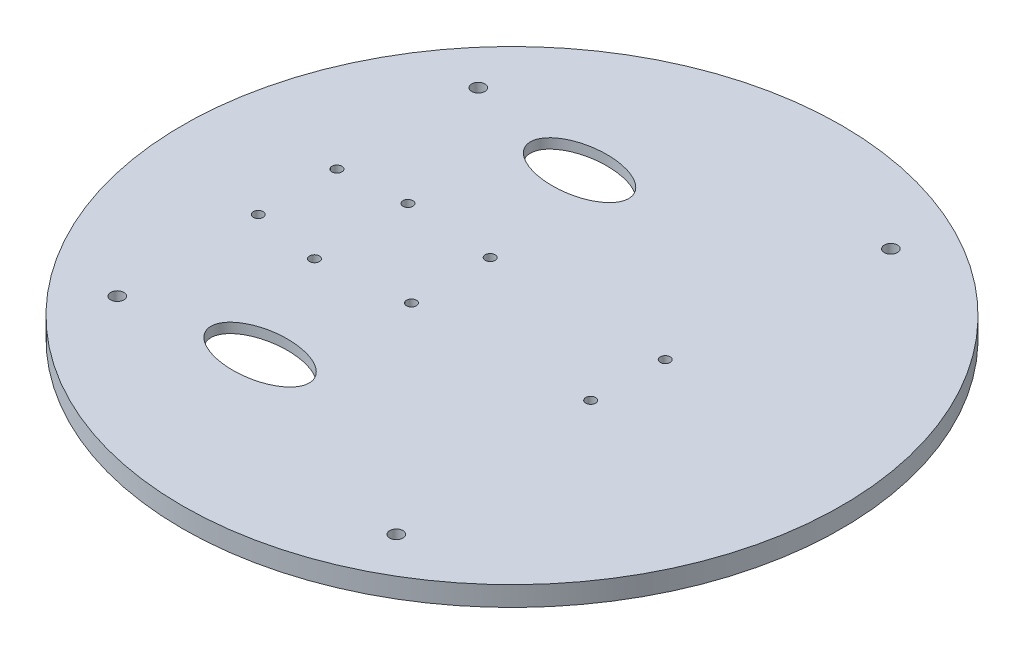
ISO-10303-21;
HEADER;
FILE_DESCRIPTION(('STEP AP214'),'2;1');
FILE_NAME('part.step','',(''),(''),'','','');
FILE_SCHEMA(('AUTOMOTIVE_DESIGN { 1 0 10303 214 1 1 1 1 }'));
ENDSEC;
DATA;
#1=APPLICATION_CONTEXT('core data for automotive mechanical design processes');
#2=APPLICATION_PROTOCOL_DEFINITION('international standard','automotive_design',2000,#1);
#3=PRODUCT_CONTEXT('',#1,'mechanical');
#4=PRODUCT('Part','Part','',(#3));
#5=PRODUCT_RELATED_PRODUCT_CATEGORY('part','',(#4));
#6=PRODUCT_DEFINITION_FORMATION('','',#4);
#7=PRODUCT_DEFINITION_CONTEXT('part definition',#1,'design');
#8=PRODUCT_DEFINITION('design','',#6,#7);
#9=PRODUCT_DEFINITION_SHAPE('','',#8);
#10=(LENGTH_UNIT() NAMED_UNIT(*) SI_UNIT(.MILLI.,.METRE.));
#11=(NAMED_UNIT(*) PLANE_ANGLE_UNIT() SI_UNIT($,.RADIAN.));
#12=(NAMED_UNIT(*) SI_UNIT($,.STERADIAN.) SOLID_ANGLE_UNIT());
#13=UNCERTAINTY_MEASURE_WITH_UNIT(LENGTH_MEASURE(1.E-05),#10,'distance_accuracy_value','');
#14=(GEOMETRIC_REPRESENTATION_CONTEXT(3) GLOBAL_UNCERTAINTY_ASSIGNED_CONTEXT((#13)) GLOBAL_UNIT_ASSIGNED_CONTEXT((#10,
#11,#12)) REPRESENTATION_CONTEXT('',''));
#15=CARTESIAN_POINT('',(0.,0.,0.));
#16=DIRECTION('',(0.,0.,1.));
#17=DIRECTION('',(1.,0.,0.));
#18=AXIS2_PLACEMENT_3D('',#15,#16,#17);
#19=CARTESIAN_POINT('',(0.,0.,0.));
#20=DIRECTION('',(0.,1.,0.));
#21=DIRECTION('',(0.,0.,1.));
#22=AXIS2_PLACEMENT_3D('',#19,#20,#21);
#23=PLANE('',#22);
#24=CARTESIAN_POINT('',(-65.,0.,-54.7722557505167));
#25=DIRECTION('',(0.,1.,0.));
#26=DIRECTION('',(0.,0.,1.));
#27=AXIS2_PLACEMENT_3D('',#24,#25,#26);
#28=CIRCLE('',#27,2.);
#29=CARTESIAN_POINT('',(-65.,0.,-52.7722557505167));
#30=VERTEX_POINT('',#29);
#31=EDGE_CURVE('E63',#30,#30,#28,.T.);
#32=ORIENTED_EDGE('',*,*,#31,.T.);
#33=EDGE_LOOP('',(#32));
#34=FACE_BOUND('',#33,.T.);
#35=CARTESIAN_POINT('',(-65.,0.,54.7722557505167));
#36=DIRECTION('',(0.,1.,0.));
#37=DIRECTION('',(0.,0.,1.));
#38=AXIS2_PLACEMENT_3D('',#35,#36,#37);
#39=CIRCLE('',#38,2.);
#40=CARTESIAN_POINT('',(-65.,0.,56.7722557505167));
#41=VERTEX_POINT('',#40);
#42=EDGE_CURVE('E67',#41,#41,#39,.T.);
#43=ORIENTED_EDGE('',*,*,#42,.T.);
#44=EDGE_LOOP('',(#43));
#45=FACE_BOUND('',#44,.T.);
#46=CARTESIAN_POINT('',(39.936936383401,0.,75.0335998890376));
#47=DIRECTION('',(0.,1.,0.));
#48=DIRECTION('',(0.,0.,1.));
#49=AXIS2_PLACEMENT_3D('',#46,#47,#48);
#50=CIRCLE('',#49,2.);
#51=CARTESIAN_POINT('',(39.936936383401,0.,77.0335998890376));
#52=VERTEX_POINT('',#51);
#53=EDGE_CURVE('E57',#52,#52,#50,.T.);
#54=ORIENTED_EDGE('',*,*,#53,.T.);
#55=EDGE_LOOP('',(#54));
#56=FACE_BOUND('',#55,.T.);
#57=CARTESIAN_POINT('',(39.9369363834019,0.,-75.0335998890372));
#58=DIRECTION('',(0.,1.,0.));
#59=DIRECTION('',(0.,0.,1.));
#60=AXIS2_PLACEMENT_3D('',#57,#58,#59);
#61=CIRCLE('',#60,2.);
#62=CARTESIAN_POINT('',(39.9369363834019,0.,-73.0335998890371));
#63=VERTEX_POINT('',#62);
#64=EDGE_CURVE('E51',#63,#63,#61,.T.);
#65=ORIENTED_EDGE('',*,*,#64,.T.);
#66=EDGE_LOOP('',(#65));
#67=FACE_BOUND('',#66,.T.);
#68=CARTESIAN_POINT('',(-18.5643986683313,0.,-11.94));
#69=DIRECTION('',(0.,1.,0.));
#70=DIRECTION('',(0.,0.,1.));
#71=AXIS2_PLACEMENT_3D('',#68,#69,#70);
#72=CIRCLE('',#71,1.5);
#73=CARTESIAN_POINT('',(-18.5643986683313,0.,-10.44));
#74=VERTEX_POINT('',#73);
#75=EDGE_CURVE('E74',#74,#74,#72,.T.);
#76=ORIENTED_EDGE('',*,*,#75,.T.);
#77=EDGE_LOOP('',(#76));
#78=FACE_BOUND('',#77,.T.);
#79=CARTESIAN_POINT('',(-44.8932100922115,0.,15.0367397926741));
#80=DIRECTION('',(0.,1.,0.));
#81=DIRECTION('',(0.,0.,1.));
#82=AXIS2_PLACEMENT_3D('',#79,#80,#81);
#83=CIRCLE('',#82,1.5);
#84=CARTESIAN_POINT('',(-44.8932100922115,0.,16.5367397926741));
#85=VERTEX_POINT('',#84);
#86=EDGE_CURVE('E78',#85,#85,#83,.T.);
#87=ORIENTED_EDGE('',*,*,#86,.T.);
#88=EDGE_LOOP('',(#87));
#89=FACE_BOUND('',#88,.T.);
#90=CARTESIAN_POINT('',(-45.2499231257014,0.,-13.677319461203));
#91=DIRECTION('',(0.,1.,0.));
#92=DIRECTION('',(0.,0.,1.));
#93=AXIS2_PLACEMENT_3D('',#90,#91,#92);
#94=CIRCLE('',#93,1.5);
#95=CARTESIAN_POINT('',(-45.2499231257014,0.,-12.177319461203));
#96=VERTEX_POINT('',#95);
#97=EDGE_CURVE('E83',#96,#96,#94,.T.);
#98=ORIENTED_EDGE('',*,*,#97,.T.);
#99=EDGE_LOOP('',(#98));
#100=FACE_BOUND('',#99,.T.);
#101=CARTESIAN_POINT('',(34.828715810279,0.,-11.6656914459102));
#102=DIRECTION('',(0.,1.,0.));
#103=DIRECTION('',(0.,0.,1.));
#104=AXIS2_PLACEMENT_3D('',#101,#102,#103);
#105=CIRCLE('',#104,1.50000000000001);
#106=CARTESIAN_POINT('',(34.828715810279,0.,-10.1656914459102));
#107=VERTEX_POINT('',#106);
#108=EDGE_CURVE('E87',#107,#107,#105,.T.);
#109=ORIENTED_EDGE('',*,*,#108,.T.);
#110=EDGE_LOOP('',(#109));
#111=FACE_BOUND('',#110,.T.);
#112=CARTESIAN_POINT('',(-65.0643986683313,0.,-11.94));
#113=DIRECTION('',(0.,1.,0.));
#114=DIRECTION('',(0.,0.,1.));
#115=AXIS2_PLACEMENT_3D('',#112,#113,#114);
#116=CIRCLE('',#115,1.5);
#117=CARTESIAN_POINT('',(-65.0643986683313,0.,-10.44));
#118=VERTEX_POINT('',#117);
#119=EDGE_CURVE('E91',#118,#118,#116,.T.);
#120=ORIENTED_EDGE('',*,*,#119,.T.);
#121=EDGE_LOOP('',(#120));
#122=FACE_BOUND('',#121,.T.);
#123=CARTESIAN_POINT('',(-18.5643986683313,0.,11.94));
#124=DIRECTION('',(0.,1.,0.));
#125=DIRECTION('',(0.,0.,1.));
#126=AXIS2_PLACEMENT_3D('',#123,#124,#125);
#127=CIRCLE('',#126,1.5);
#128=CARTESIAN_POINT('',(-18.5643986683313,0.,13.44));
#129=VERTEX_POINT('',#128);
#130=EDGE_CURVE('E95',#129,#129,#127,.T.);
#131=ORIENTED_EDGE('',*,*,#130,.T.);
#132=EDGE_LOOP('',(#131));
#133=FACE_BOUND('',#132,.T.);
#134=CARTESIAN_POINT('',(-65.0643986683313,0.,11.94));
#135=DIRECTION('',(0.,1.,0.));
#136=DIRECTION('',(0.,0.,1.));
#137=AXIS2_PLACEMENT_3D('',#134,#135,#136);
#138=CIRCLE('',#137,1.5);
#139=CARTESIAN_POINT('',(-65.0643986683313,0.,13.44));
#140=VERTEX_POINT('',#139);
#141=EDGE_CURVE('E99',#140,#140,#138,.T.);
#142=ORIENTED_EDGE('',*,*,#141,.T.);
#143=EDGE_LOOP('',(#142));
#144=FACE_BOUND('',#143,.T.);
#145=CARTESIAN_POINT('',(34.2098022428192,0.,10.3403135664966));
#146=DIRECTION('',(0.,1.,0.));
#147=DIRECTION('',(0.,0.,1.));
#148=AXIS2_PLACEMENT_3D('',#145,#146,#147);
#149=CIRCLE('',#148,1.5);
#150=CARTESIAN_POINT('',(34.2098022428192,0.,11.8403135664966));
#151=VERTEX_POINT('',#150);
#152=EDGE_CURVE('E103',#151,#151,#149,.T.);
#153=ORIENTED_EDGE('',*,*,#152,.T.);
#154=EDGE_LOOP('',(#153));
#155=FACE_BOUND('',#154,.T.);
#156=CARTESIAN_POINT('',(-27.9650436953808,0.,48.4727424053267));
#157=DIRECTION('',(0.,1.,0.));
#158=DIRECTION('',(1.,0.,0.));
#159=AXIS2_PLACEMENT_3D('',#156,#157,#158);
#160=ELLIPSE('',#159,14.9146899708698,8.25634623387433);
#161=CARTESIAN_POINT('',(-13.050353724511,0.,48.4727424053267));
#162=VERTEX_POINT('',#161);
#163=EDGE_CURVE('E107',#162,#162,#160,.T.);
#164=ORIENTED_EDGE('',*,*,#163,.T.);
#165=EDGE_LOOP('',(#164));
#166=FACE_BOUND('',#165,.T.);
#167=CARTESIAN_POINT('',(-27.9650436953808,0.,-48.4727424053267));
#168=DIRECTION('',(0.,1.,0.));
#169=DIRECTION('',(1.,0.,0.));
#170=AXIS2_PLACEMENT_3D('',#167,#168,#169);
#171=ELLIPSE('',#170,14.9146899708698,8.25634623387433);
#172=CARTESIAN_POINT('',(-13.050353724511,0.,-48.4727424053267));
#173=VERTEX_POINT('',#172);
#174=EDGE_CURVE('E46',#173,#173,#171,.T.);
#175=ORIENTED_EDGE('',*,*,#174,.T.);
#176=EDGE_LOOP('',(#175));
#177=FACE_BOUND('',#176,.T.);
#178=CARTESIAN_POINT('',(0.,0.,0.));
#179=DIRECTION('',(0.,-1.,0.));
#180=DIRECTION('',(0.,0.,-1.));
#181=AXIS2_PLACEMENT_3D('',#178,#179,#180);
#182=CIRCLE('',#181,97.);
#183=CARTESIAN_POINT('',(0.,0.,-97.));
#184=VERTEX_POINT('',#183);
#185=EDGE_CURVE('E227',#184,#184,#182,.T.);
#186=ORIENTED_EDGE('',*,*,#185,.T.);
#187=EDGE_LOOP('',(#186));
#188=FACE_BOUND('',#187,.T.);
#189=ADVANCED_FACE('F42',(#34,#45,#56,#67,#78,#89,#100,#111,#122,#133,#144,#155,#166,#177,#188),
#23,.F.);
#190=CARTESIAN_POINT('',(0.,3.,0.));
#191=DIRECTION('',(0.,-1.,0.));
#192=DIRECTION('',(0.,0.,-1.));
#193=AXIS2_PLACEMENT_3D('',#190,#191,#192);
#194=CYLINDRICAL_SURFACE('',#193,100.);
#195=CARTESIAN_POINT('',(0.,3.,0.));
#196=DIRECTION('',(0.,1.,0.));
#197=DIRECTION('',(0.,0.,1.));
#198=AXIS2_PLACEMENT_3D('',#195,#196,#197);
#199=CIRCLE('',#198,100.);
#200=CARTESIAN_POINT('',(0.,3.,100.));
#201=VERTEX_POINT('',#200);
#202=EDGE_CURVE('E10',#201,#201,#199,.T.);
#203=ORIENTED_EDGE('',*,*,#202,.F.);
#204=EDGE_LOOP('',(#203));
#205=FACE_BOUND('',#204,.T.);
#206=CARTESIAN_POINT('',(0.,-3.,0.));
#207=DIRECTION('',(0.,-1.,0.));
#208=DIRECTION('',(0.,0.,-1.));
#209=AXIS2_PLACEMENT_3D('',#206,#207,#208);
#210=CIRCLE('',#209,100.);
#211=CARTESIAN_POINT('',(0.,-3.,-100.));
#212=VERTEX_POINT('',#211);
#213=EDGE_CURVE('E124',#212,#212,#210,.T.);
#214=ORIENTED_EDGE('',*,*,#213,.F.);
#215=EDGE_LOOP('',(#214));
#216=FACE_BOUND('',#215,.T.);
#217=ADVANCED_FACE('F44',(#205,#216),#194,.T.);
#218=CARTESIAN_POINT('',(0.,3.,0.));
#219=DIRECTION('',(0.,1.,0.));
#220=DIRECTION('',(0.,0.,1.));
#221=AXIS2_PLACEMENT_3D('',#218,#219,#220);
#222=PLANE('',#221);
#223=CARTESIAN_POINT('',(-27.9650436953808,3.,-48.4727424053267));
#224=DIRECTION('',(0.,1.,0.));
#225=DIRECTION('',(1.,0.,0.));
#226=AXIS2_PLACEMENT_3D('',#223,#224,#225);
#227=ELLIPSE('',#226,14.9146899708698,8.25634623387433);
#228=CARTESIAN_POINT('',(-13.050353724511,3.,-48.4727424053267));
#229=VERTEX_POINT('',#228);
#230=EDGE_CURVE('E110',#229,#229,#227,.T.);
#231=ORIENTED_EDGE('',*,*,#230,.F.);
#232=EDGE_LOOP('',(#231));
#233=FACE_BOUND('',#232,.T.);
#234=CARTESIAN_POINT('',(-27.9650436953808,3.,48.4727424053267));
#235=DIRECTION('',(0.,1.,0.));
#236=DIRECTION('',(1.,0.,0.));
#237=AXIS2_PLACEMENT_3D('',#234,#235,#236);
#238=ELLIPSE('',#237,14.9146899708698,8.25634623387433);
#239=CARTESIAN_POINT('',(-13.050353724511,3.,48.4727424053267));
#240=VERTEX_POINT('',#239);
#241=EDGE_CURVE('E118',#240,#240,#238,.T.);
#242=ORIENTED_EDGE('',*,*,#241,.F.);
#243=EDGE_LOOP('',(#242));
#244=FACE_BOUND('',#243,.T.);
#245=CARTESIAN_POINT('',(34.2098022428192,3.,10.3403135664966));
#246=DIRECTION('',(0.,1.,0.));
#247=DIRECTION('',(0.,0.,-1.));
#248=AXIS2_PLACEMENT_3D('',#245,#246,#247);
#249=CIRCLE('',#248,1.5);
#250=CARTESIAN_POINT('',(34.2098022428192,3.,8.84031356649656));
#251=VERTEX_POINT('',#250);
#252=EDGE_CURVE('E423',#251,#251,#249,.T.);
#253=ORIENTED_EDGE('',*,*,#252,.F.);
#254=EDGE_LOOP('',(#253));
#255=FACE_BOUND('',#254,.T.);
#256=CARTESIAN_POINT('',(-65.0643986683313,3.,11.94));
#257=DIRECTION('',(0.,1.,0.));
#258=DIRECTION('',(0.,0.,1.));
#259=AXIS2_PLACEMENT_3D('',#256,#257,#258);
#260=CIRCLE('',#259,1.5);
#261=CARTESIAN_POINT('',(-65.0643986683313,3.,13.44));
#262=VERTEX_POINT('',#261);
#263=EDGE_CURVE('E427',#262,#262,#260,.T.);
#264=ORIENTED_EDGE('',*,*,#263,.F.);
#265=EDGE_LOOP('',(#264));
#266=FACE_BOUND('',#265,.T.);
#267=CARTESIAN_POINT('',(-18.5643986683313,3.,11.94));
#268=DIRECTION('',(0.,1.,0.));
#269=DIRECTION('',(0.,0.,1.));
#270=AXIS2_PLACEMENT_3D('',#267,#268,#269);
#271=CIRCLE('',#270,1.5);
#272=CARTESIAN_POINT('',(-18.5643986683313,3.,13.44));
#273=VERTEX_POINT('',#272);
#274=EDGE_CURVE('E431',#273,#273,#271,.T.);
#275=ORIENTED_EDGE('',*,*,#274,.F.);
#276=EDGE_LOOP('',(#275));
#277=FACE_BOUND('',#276,.T.);
#278=CARTESIAN_POINT('',(-65.0643986683313,3.,-11.94));
#279=DIRECTION('',(0.,1.,0.));
#280=DIRECTION('',(0.,0.,1.));
#281=AXIS2_PLACEMENT_3D('',#278,#279,#280);
#282=CIRCLE('',#281,1.5);
#283=CARTESIAN_POINT('',(-65.0643986683313,3.,-10.44));
#284=VERTEX_POINT('',#283);
#285=EDGE_CURVE('E435',#284,#284,#282,.T.);
#286=ORIENTED_EDGE('',*,*,#285,.F.);
#287=EDGE_LOOP('',(#286));
#288=FACE_BOUND('',#287,.T.);
#289=CARTESIAN_POINT('',(34.828715810279,3.,-11.6656914459102));
#290=DIRECTION('',(0.,1.,0.));
#291=DIRECTION('',(0.,0.,-1.));
#292=AXIS2_PLACEMENT_3D('',#289,#290,#291);
#293=CIRCLE('',#292,1.50000000000001);
#294=CARTESIAN_POINT('',(34.828715810279,3.,-13.1656914459102));
#295=VERTEX_POINT('',#294);
#296=EDGE_CURVE('E132',#295,#295,#293,.T.);
#297=ORIENTED_EDGE('',*,*,#296,.F.);
#298=EDGE_LOOP('',(#297));
#299=FACE_BOUND('',#298,.T.);
#300=CARTESIAN_POINT('',(-45.2499231257014,3.,-13.677319461203));
#301=DIRECTION('',(0.,1.,0.));
#302=DIRECTION('',(0.,0.,-1.));
#303=AXIS2_PLACEMENT_3D('',#300,#301,#302);
#304=CIRCLE('',#303,1.5);
#305=CARTESIAN_POINT('',(-45.2499231257014,3.,-15.177319461203));
#306=VERTEX_POINT('',#305);
#307=EDGE_CURVE('E442',#306,#306,#304,.T.);
#308=ORIENTED_EDGE('',*,*,#307,.F.);
#309=EDGE_LOOP('',(#308));
#310=FACE_BOUND('',#309,.T.);
#311=CARTESIAN_POINT('',(-44.8932100922115,3.,15.0367397926741));
#312=DIRECTION('',(0.,1.,0.));
#313=DIRECTION('',(0.,0.,-1.));
#314=AXIS2_PLACEMENT_3D('',#311,#312,#313);
#315=CIRCLE('',#314,1.5);
#316=CARTESIAN_POINT('',(-44.8932100922115,3.,13.5367397926741));
#317=VERTEX_POINT('',#316);
#318=EDGE_CURVE('E116',#317,#317,#315,.T.);
#319=ORIENTED_EDGE('',*,*,#318,.F.);
#320=EDGE_LOOP('',(#319));
#321=FACE_BOUND('',#320,.T.);
#322=CARTESIAN_POINT('',(-18.5643986683313,3.,-11.94));
#323=DIRECTION('',(0.,1.,0.));
#324=DIRECTION('',(0.,0.,1.));
#325=AXIS2_PLACEMENT_3D('',#322,#323,#324);
#326=CIRCLE('',#325,1.5);
#327=CARTESIAN_POINT('',(-18.5643986683313,3.,-10.44));
#328=VERTEX_POINT('',#327);
#329=EDGE_CURVE('E79',#328,#328,#326,.T.);
#330=ORIENTED_EDGE('',*,*,#329,.F.);
#331=EDGE_LOOP('',(#330));
#332=FACE_BOUND('',#331,.T.);
#333=CARTESIAN_POINT('',(39.9369363834019,3.,-75.0335998890372));
#334=DIRECTION('',(0.,1.,0.));
#335=DIRECTION('',(0.,0.,1.));
#336=AXIS2_PLACEMENT_3D('',#333,#334,#335);
#337=CIRCLE('',#336,2.);
#338=CARTESIAN_POINT('',(39.9369363834019,3.,-73.0335998890371));
#339=VERTEX_POINT('',#338);
#340=EDGE_CURVE('E106',#339,#339,#337,.T.);
#341=ORIENTED_EDGE('',*,*,#340,.F.);
#342=EDGE_LOOP('',(#341));
#343=FACE_BOUND('',#342,.T.);
#344=CARTESIAN_POINT('',(39.936936383401,3.,75.0335998890376));
#345=DIRECTION('',(0.,1.,0.));
#346=DIRECTION('',(0.,0.,1.));
#347=AXIS2_PLACEMENT_3D('',#344,#345,#346);
#348=CIRCLE('',#347,2.);
#349=CARTESIAN_POINT('',(39.936936383401,3.,77.0335998890376));
#350=VERTEX_POINT('',#349);
#351=EDGE_CURVE('E455',#350,#350,#348,.T.);
#352=ORIENTED_EDGE('',*,*,#351,.F.);
#353=EDGE_LOOP('',(#352));
#354=FACE_BOUND('',#353,.T.);
#355=CARTESIAN_POINT('',(-65.,3.,54.7722557505167));
#356=DIRECTION('',(0.,1.,0.));
#357=DIRECTION('',(0.,0.,1.));
#358=AXIS2_PLACEMENT_3D('',#355,#356,#357);
#359=CIRCLE('',#358,2.);
#360=CARTESIAN_POINT('',(-65.,3.,56.7722557505167));
#361=VERTEX_POINT('',#360);
#362=EDGE_CURVE('E459',#361,#361,#359,.T.);
#363=ORIENTED_EDGE('',*,*,#362,.F.);
#364=EDGE_LOOP('',(#363));
#365=FACE_BOUND('',#364,.T.);
#366=CARTESIAN_POINT('',(-65.,3.,-54.7722557505167));
#367=DIRECTION('',(0.,1.,0.));
#368=DIRECTION('',(0.,0.,1.));
#369=AXIS2_PLACEMENT_3D('',#366,#367,#368);
#370=CIRCLE('',#369,2.);
#371=CARTESIAN_POINT('',(-65.,3.,-52.7722557505167));
#372=VERTEX_POINT('',#371);
#373=EDGE_CURVE('E61',#372,#372,#370,.T.);
#374=ORIENTED_EDGE('',*,*,#373,.F.);
#375=EDGE_LOOP('',(#374));
#376=FACE_BOUND('',#375,.T.);
#377=ORIENTED_EDGE('',*,*,#202,.T.);
#378=EDGE_LOOP('',(#377));
#379=FACE_BOUND('',#378,.T.);
#380=ADVANCED_FACE('F189',(#233,#244,#255,#266,#277,#288,#299,#310,#321,#332,#343,#354,#365,
#376,#379),#222,.T.);
#381=CARTESIAN_POINT('',(-65.,-7.,-54.7722557505167));
#382=DIRECTION('',(0.,1.,0.));
#383=DIRECTION('',(0.,0.,1.));
#384=AXIS2_PLACEMENT_3D('',#381,#382,#383);
#385=CYLINDRICAL_SURFACE('',#384,2.);
#386=ORIENTED_EDGE('',*,*,#373,.T.);
#387=EDGE_LOOP('',(#386));
#388=FACE_BOUND('',#387,.T.);
#389=ORIENTED_EDGE('',*,*,#31,.F.);
#390=EDGE_LOOP('',(#389));
#391=FACE_BOUND('',#390,.T.);
#392=ADVANCED_FACE('F179',(#388,#391),#385,.F.);
#393=CARTESIAN_POINT('',(-65.,-7.,54.7722557505167));
#394=DIRECTION('',(0.,1.,0.));
#395=DIRECTION('',(0.,0.,1.));
#396=AXIS2_PLACEMENT_3D('',#393,#394,#395);
#397=CYLINDRICAL_SURFACE('',#396,2.);
#398=ORIENTED_EDGE('',*,*,#362,.T.);
#399=EDGE_LOOP('',(#398));
#400=FACE_BOUND('',#399,.T.);
#401=ORIENTED_EDGE('',*,*,#42,.F.);
#402=EDGE_LOOP('',(#401));
#403=FACE_BOUND('',#402,.T.);
#404=ADVANCED_FACE('F175',(#400,#403),#397,.F.);
#405=CARTESIAN_POINT('',(39.936936383401,-7.,75.0335998890376));
#406=DIRECTION('',(0.,1.,0.));
#407=DIRECTION('',(0.,0.,1.));
#408=AXIS2_PLACEMENT_3D('',#405,#406,#407);
#409=CYLINDRICAL_SURFACE('',#408,2.);
#410=ORIENTED_EDGE('',*,*,#351,.T.);
#411=EDGE_LOOP('',(#410));
#412=FACE_BOUND('',#411,.T.);
#413=ORIENTED_EDGE('',*,*,#53,.F.);
#414=EDGE_LOOP('',(#413));
#415=FACE_BOUND('',#414,.T.);
#416=ADVANCED_FACE('F178',(#412,#415),#409,.F.);
#417=CARTESIAN_POINT('',(39.9369363834019,-7.,-75.0335998890372));
#418=DIRECTION('',(0.,1.,0.));
#419=DIRECTION('',(0.,0.,1.));
#420=AXIS2_PLACEMENT_3D('',#417,#418,#419);
#421=CYLINDRICAL_SURFACE('',#420,2.);
#422=ORIENTED_EDGE('',*,*,#340,.T.);
#423=EDGE_LOOP('',(#422));
#424=FACE_BOUND('',#423,.T.);
#425=ORIENTED_EDGE('',*,*,#64,.F.);
#426=EDGE_LOOP('',(#425));
#427=FACE_BOUND('',#426,.T.);
#428=ADVANCED_FACE('F173',(#424,#427),#421,.F.);
#429=CARTESIAN_POINT('',(-18.5643986683313,-7.,-11.94));
#430=DIRECTION('',(0.,1.,0.));
#431=DIRECTION('',(0.,0.,1.));
#432=AXIS2_PLACEMENT_3D('',#429,#430,#431);
#433=CYLINDRICAL_SURFACE('',#432,1.5);
#434=ORIENTED_EDGE('',*,*,#329,.T.);
#435=EDGE_LOOP('',(#434));
#436=FACE_BOUND('',#435,.T.);
#437=ORIENTED_EDGE('',*,*,#75,.F.);
#438=EDGE_LOOP('',(#437));
#439=FACE_BOUND('',#438,.T.);
#440=ADVANCED_FACE('F155',(#436,#439),#433,.F.);
#441=CARTESIAN_POINT('',(-44.8932100922115,-7.,15.0367397926741));
#442=DIRECTION('',(0.,1.,0.));
#443=DIRECTION('',(0.,0.,1.));
#444=AXIS2_PLACEMENT_3D('',#441,#442,#443);
#445=CYLINDRICAL_SURFACE('',#444,1.5);
#446=ORIENTED_EDGE('',*,*,#318,.T.);
#447=EDGE_LOOP('',(#446));
#448=FACE_BOUND('',#447,.T.);
#449=ORIENTED_EDGE('',*,*,#86,.F.);
#450=EDGE_LOOP('',(#449));
#451=FACE_BOUND('',#450,.T.);
#452=ADVANCED_FACE('F151',(#448,#451),#445,.F.);
#453=CARTESIAN_POINT('',(-45.2499231257014,-7.,-13.677319461203));
#454=DIRECTION('',(0.,1.,0.));
#455=DIRECTION('',(0.,0.,1.));
#456=AXIS2_PLACEMENT_3D('',#453,#454,#455);
#457=CYLINDRICAL_SURFACE('',#456,1.5);
#458=ORIENTED_EDGE('',*,*,#307,.T.);
#459=EDGE_LOOP('',(#458));
#460=FACE_BOUND('',#459,.T.);
#461=ORIENTED_EDGE('',*,*,#97,.F.);
#462=EDGE_LOOP('',(#461));
#463=FACE_BOUND('',#462,.T.);
#464=ADVANCED_FACE('F147',(#460,#463),#457,.F.);
#465=CARTESIAN_POINT('',(34.828715810279,-7.,-11.6656914459102));
#466=DIRECTION('',(0.,1.,0.));
#467=DIRECTION('',(0.,0.,1.));
#468=AXIS2_PLACEMENT_3D('',#465,#466,#467);
#469=CYLINDRICAL_SURFACE('',#468,1.50000000000001);
#470=ORIENTED_EDGE('',*,*,#296,.T.);
#471=EDGE_LOOP('',(#470));
#472=FACE_BOUND('',#471,.T.);
#473=ORIENTED_EDGE('',*,*,#108,.F.);
#474=EDGE_LOOP('',(#473));
#475=FACE_BOUND('',#474,.T.);
#476=ADVANCED_FACE('F143',(#472,#475),#469,.F.);
#477=CARTESIAN_POINT('',(-65.0643986683313,-7.,-11.94));
#478=DIRECTION('',(0.,1.,0.));
#479=DIRECTION('',(0.,0.,1.));
#480=AXIS2_PLACEMENT_3D('',#477,#478,#479);
#481=CYLINDRICAL_SURFACE('',#480,1.5);
#482=ORIENTED_EDGE('',*,*,#285,.T.);
#483=EDGE_LOOP('',(#482));
#484=FACE_BOUND('',#483,.T.);
#485=ORIENTED_EDGE('',*,*,#119,.F.);
#486=EDGE_LOOP('',(#485));
#487=FACE_BOUND('',#486,.T.);
#488=ADVANCED_FACE('F146',(#484,#487),#481,.F.);
#489=CARTESIAN_POINT('',(-18.5643986683313,-7.,11.94));
#490=DIRECTION('',(0.,1.,0.));
#491=DIRECTION('',(0.,0.,1.));
#492=AXIS2_PLACEMENT_3D('',#489,#490,#491);
#493=CYLINDRICAL_SURFACE('',#492,1.5);
#494=ORIENTED_EDGE('',*,*,#274,.T.);
#495=EDGE_LOOP('',(#494));
#496=FACE_BOUND('',#495,.T.);
#497=ORIENTED_EDGE('',*,*,#130,.F.);
#498=EDGE_LOOP('',(#497));
#499=FACE_BOUND('',#498,.T.);
#500=ADVANCED_FACE('F160',(#496,#499),#493,.F.);
#501=CARTESIAN_POINT('',(-65.0643986683313,-7.,11.94));
#502=DIRECTION('',(0.,1.,0.));
#503=DIRECTION('',(0.,0.,1.));
#504=AXIS2_PLACEMENT_3D('',#501,#502,#503);
#505=CYLINDRICAL_SURFACE('',#504,1.5);
#506=ORIENTED_EDGE('',*,*,#263,.T.);
#507=EDGE_LOOP('',(#506));
#508=FACE_BOUND('',#507,.T.);
#509=ORIENTED_EDGE('',*,*,#141,.F.);
#510=EDGE_LOOP('',(#509));
#511=FACE_BOUND('',#510,.T.);
#512=ADVANCED_FACE('F157',(#508,#511),#505,.F.);
#513=CARTESIAN_POINT('',(34.2098022428192,-7.,10.3403135664966));
#514=DIRECTION('',(0.,1.,0.));
#515=DIRECTION('',(0.,0.,1.));
#516=AXIS2_PLACEMENT_3D('',#513,#514,#515);
#517=CYLINDRICAL_SURFACE('',#516,1.5);
#518=ORIENTED_EDGE('',*,*,#252,.T.);
#519=EDGE_LOOP('',(#518));
#520=FACE_BOUND('',#519,.T.);
#521=ORIENTED_EDGE('',*,*,#152,.F.);
#522=EDGE_LOOP('',(#521));
#523=FACE_BOUND('',#522,.T.);
#524=ADVANCED_FACE('F140',(#520,#523),#517,.F.);
#525=CARTESIAN_POINT('',(-27.9650436953808,-7.,48.4727424053267));
#526=DIRECTION('',(0.,1.,0.));
#527=DIRECTION('',(1.,0.,0.));
#528=AXIS2_PLACEMENT_3D('',#525,#526,#527);
#529=ELLIPSE('',#528,14.9146899708698,8.25634623387433);
#530=DIRECTION('',(0.,1.,0.));
#531=VECTOR('',#530,1.);
#532=SURFACE_OF_LINEAR_EXTRUSION('',#529,#531);
#533=ORIENTED_EDGE('',*,*,#241,.T.);
#534=EDGE_LOOP('',(#533));
#535=FACE_BOUND('',#534,.T.);
#536=ORIENTED_EDGE('',*,*,#163,.F.);
#537=EDGE_LOOP('',(#536));
#538=FACE_BOUND('',#537,.T.);
#539=ADVANCED_FACE('F135',(#535,#538),#532,.F.);
#540=CARTESIAN_POINT('',(-27.9650436953808,-7.,-48.4727424053267));
#541=DIRECTION('',(0.,1.,0.));
#542=DIRECTION('',(1.,0.,0.));
#543=AXIS2_PLACEMENT_3D('',#540,#541,#542);
#544=ELLIPSE('',#543,14.9146899708698,8.25634623387433);
#545=DIRECTION('',(0.,1.,0.));
#546=VECTOR('',#545,1.);
#547=SURFACE_OF_LINEAR_EXTRUSION('',#544,#546);
#548=ORIENTED_EDGE('',*,*,#230,.T.);
#549=EDGE_LOOP('',(#548));
#550=FACE_BOUND('',#549,.T.);
#551=ORIENTED_EDGE('',*,*,#174,.F.);
#552=EDGE_LOOP('',(#551));
#553=FACE_BOUND('',#552,.T.);
#554=ADVANCED_FACE('F139',(#550,#553),#547,.F.);
#555=CARTESIAN_POINT('',(0.,-3.,0.));
#556=DIRECTION('',(0.,-1.,0.));
#557=DIRECTION('',(0.,0.,-1.));
#558=AXIS2_PLACEMENT_3D('',#555,#556,#557);
#559=PLANE('',#558);
#560=ORIENTED_EDGE('',*,*,#213,.T.);
#561=EDGE_LOOP('',(#560));
#562=FACE_BOUND('',#561,.T.);
#563=CARTESIAN_POINT('',(0.,-3.,0.));
#564=DIRECTION('',(0.,-1.,0.));
#565=DIRECTION('',(0.,0.,-1.));
#566=AXIS2_PLACEMENT_3D('',#563,#564,#565);
#567=CIRCLE('',#566,97.);
#568=CARTESIAN_POINT('',(0.,-3.,-97.));
#569=VERTEX_POINT('',#568);
#570=EDGE_CURVE('E230',#569,#569,#567,.T.);
#571=ORIENTED_EDGE('',*,*,#570,.F.);
#572=EDGE_LOOP('',(#571));
#573=FACE_BOUND('',#572,.T.);
#574=ADVANCED_FACE('F239',(#562,#573),#559,.T.);
#575=CARTESIAN_POINT('',(0.,-3.,0.));
#576=DIRECTION('',(0.,1.,0.));
#577=DIRECTION('',(0.,0.,1.));
#578=AXIS2_PLACEMENT_3D('',#575,#576,#577);
#579=CYLINDRICAL_SURFACE('',#578,97.);
#580=ORIENTED_EDGE('',*,*,#570,.T.);
#581=EDGE_LOOP('',(#580));
#582=FACE_BOUND('',#581,.T.);
#583=ORIENTED_EDGE('',*,*,#185,.F.);
#584=EDGE_LOOP('',(#583));
#585=FACE_BOUND('',#584,.T.);
#586=ADVANCED_FACE('F243',(#582,#585),#579,.F.);
#587=CLOSED_SHELL('',(#189,#217,#380,#392,#404,#416,#428,#440,#452,#464,#476,#488,#500,#512,
#524,#539,#554,#574,#586));
#588=MANIFOLD_SOLID_BREP('B2',#587);
#589=ADVANCED_BREP_SHAPE_REPRESENTATION('',(#18,#588),#14);
#590=SHAPE_DEFINITION_REPRESENTATION(#9,#589);
ENDSEC;
END-ISO-10303-21;
